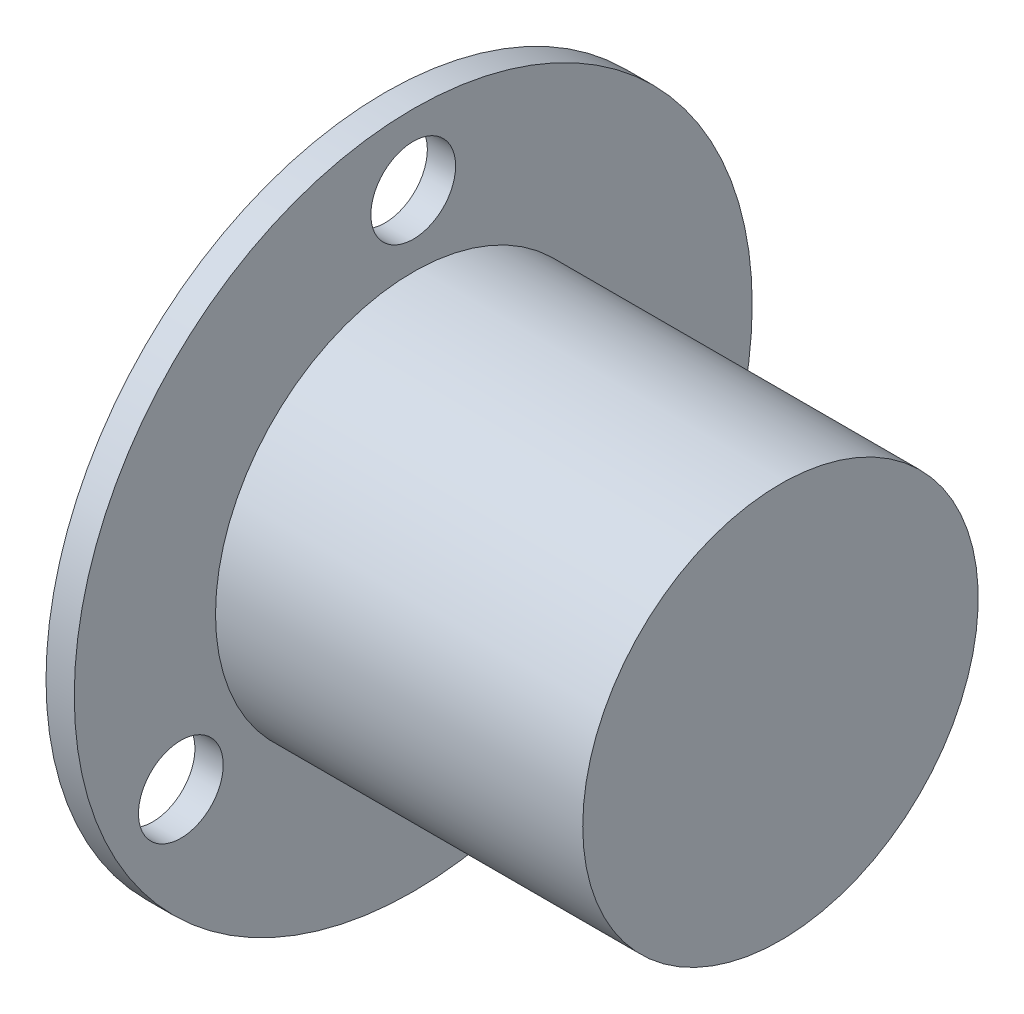
ISO-10303-21;
HEADER;
FILE_DESCRIPTION(('STEP AP214'),'2;1');
FILE_NAME('part.step','',(''),(''),'','','');
FILE_SCHEMA(('AUTOMOTIVE_DESIGN { 1 0 10303 214 1 1 1 1 }'));
ENDSEC;
DATA;
#1=APPLICATION_CONTEXT('core data for automotive mechanical design processes');
#2=APPLICATION_PROTOCOL_DEFINITION('international standard','automotive_design',2000,#1);
#3=PRODUCT_CONTEXT('',#1,'mechanical');
#4=PRODUCT('Part','Part','',(#3));
#5=PRODUCT_RELATED_PRODUCT_CATEGORY('part','',(#4));
#6=PRODUCT_DEFINITION_FORMATION('','',#4);
#7=PRODUCT_DEFINITION_CONTEXT('part definition',#1,'design');
#8=PRODUCT_DEFINITION('design','',#6,#7);
#9=PRODUCT_DEFINITION_SHAPE('','',#8);
#10=(LENGTH_UNIT() NAMED_UNIT(*) SI_UNIT(.MILLI.,.METRE.));
#11=(NAMED_UNIT(*) PLANE_ANGLE_UNIT() SI_UNIT($,.RADIAN.));
#12=(NAMED_UNIT(*) SI_UNIT($,.STERADIAN.) SOLID_ANGLE_UNIT());
#13=UNCERTAINTY_MEASURE_WITH_UNIT(LENGTH_MEASURE(1.E-05),#10,'distance_accuracy_value','');
#14=(GEOMETRIC_REPRESENTATION_CONTEXT(3) GLOBAL_UNCERTAINTY_ASSIGNED_CONTEXT((#13)) GLOBAL_UNIT_ASSIGNED_CONTEXT((#10,
#11,#12)) REPRESENTATION_CONTEXT('',''));
#15=CARTESIAN_POINT('',(0.,0.,0.));
#16=DIRECTION('',(0.,0.,1.));
#17=DIRECTION('',(1.,0.,0.));
#18=AXIS2_PLACEMENT_3D('',#15,#16,#17);
#19=CARTESIAN_POINT('',(0.,0.,0.));
#20=DIRECTION('',(1.,0.,0.));
#21=DIRECTION('',(0.,0.,-1.));
#22=AXIS2_PLACEMENT_3D('',#19,#20,#21);
#23=PLANE('',#22);
#24=CARTESIAN_POINT('',(0.,0.,0.));
#25=DIRECTION('',(1.,0.,0.));
#26=DIRECTION('',(0.,0.,-1.));
#27=AXIS2_PLACEMENT_3D('',#24,#25,#26);
#28=CIRCLE('',#27,12.);
#29=CARTESIAN_POINT('',(0.,0.,-12.));
#30=VERTEX_POINT('',#29);
#31=EDGE_CURVE('E42',#30,#30,#28,.T.);
#32=ORIENTED_EDGE('',*,*,#31,.F.);
#33=EDGE_LOOP('',(#32));
#34=FACE_BOUND('',#33,.T.);
#35=CARTESIAN_POINT('',(0.,9.5,0.));
#36=DIRECTION('',(1.,0.,0.));
#37=DIRECTION('',(0.,0.,-1.));
#38=AXIS2_PLACEMENT_3D('',#35,#36,#37);
#39=CIRCLE('',#38,1.5);
#40=CARTESIAN_POINT('',(0.,9.5,-1.5));
#41=VERTEX_POINT('',#40);
#42=EDGE_CURVE('E52',#41,#41,#39,.T.);
#43=ORIENTED_EDGE('',*,*,#42,.T.);
#44=EDGE_LOOP('',(#43));
#45=FACE_BOUND('',#44,.T.);
#46=CARTESIAN_POINT('',(0.,-4.74999999999965,-8.22724133595277));
#47=DIRECTION('',(1.,0.,0.));
#48=DIRECTION('',(0.,0.,-1.));
#49=AXIS2_PLACEMENT_3D('',#46,#47,#48);
#50=CIRCLE('',#49,1.50000000000052);
#51=CARTESIAN_POINT('',(0.,-4.74999999999965,-9.7272413359533));
#52=VERTEX_POINT('',#51);
#53=EDGE_CURVE('E58',#52,#52,#50,.T.);
#54=ORIENTED_EDGE('',*,*,#53,.T.);
#55=EDGE_LOOP('',(#54));
#56=FACE_BOUND('',#55,.T.);
#57=CARTESIAN_POINT('',(0.,-4.75000000000035,8.22724133595156));
#58=DIRECTION('',(1.,0.,0.));
#59=DIRECTION('',(0.,0.,-1.));
#60=AXIS2_PLACEMENT_3D('',#57,#58,#59);
#61=CIRCLE('',#60,1.50000000000077);
#62=CARTESIAN_POINT('',(0.,-4.75000000000035,6.72724133595079));
#63=VERTEX_POINT('',#62);
#64=EDGE_CURVE('E64',#63,#63,#61,.T.);
#65=ORIENTED_EDGE('',*,*,#64,.T.);
#66=EDGE_LOOP('',(#65));
#67=FACE_BOUND('',#66,.T.);
#68=CARTESIAN_POINT('',(0.,0.,0.));
#69=DIRECTION('',(1.,0.,0.));
#70=DIRECTION('',(0.,0.,-1.));
#71=AXIS2_PLACEMENT_3D('',#68,#69,#70);
#72=CIRCLE('',#71,2.5);
#73=CARTESIAN_POINT('',(0.,0.,-2.5));
#74=VERTEX_POINT('',#73);
#75=EDGE_CURVE('E10',#74,#74,#72,.F.);
#76=ORIENTED_EDGE('',*,*,#75,.F.);
#77=EDGE_LOOP('',(#76));
#78=FACE_BOUND('',#77,.T.);
#79=ADVANCED_FACE('F31',(#34,#45,#56,#67,#78),#23,.F.);
#80=CARTESIAN_POINT('',(1.,0.,0.));
#81=DIRECTION('',(1.,0.,0.));
#82=DIRECTION('',(0.,0.,-1.));
#83=AXIS2_PLACEMENT_3D('',#80,#81,#82);
#84=PLANE('',#83);
#85=CARTESIAN_POINT('',(1.,-4.75000000000035,8.22724133595156));
#86=DIRECTION('',(1.,0.,0.));
#87=DIRECTION('',(0.,0.,-1.));
#88=AXIS2_PLACEMENT_3D('',#85,#86,#87);
#89=CIRCLE('',#88,1.50000000000077);
#90=CARTESIAN_POINT('',(1.,-4.75000000000035,6.72724133595079));
#91=VERTEX_POINT('',#90);
#92=EDGE_CURVE('E67',#91,#91,#89,.T.);
#93=ORIENTED_EDGE('',*,*,#92,.F.);
#94=EDGE_LOOP('',(#93));
#95=FACE_BOUND('',#94,.T.);
#96=CARTESIAN_POINT('',(1.,-4.74999999999965,-8.22724133595277));
#97=DIRECTION('',(1.,0.,0.));
#98=DIRECTION('',(0.,0.,-1.));
#99=AXIS2_PLACEMENT_3D('',#96,#97,#98);
#100=CIRCLE('',#99,1.50000000000052);
#101=CARTESIAN_POINT('',(1.,-4.74999999999965,-9.7272413359533));
#102=VERTEX_POINT('',#101);
#103=EDGE_CURVE('E61',#102,#102,#100,.T.);
#104=ORIENTED_EDGE('',*,*,#103,.F.);
#105=EDGE_LOOP('',(#104));
#106=FACE_BOUND('',#105,.T.);
#107=CARTESIAN_POINT('',(1.,9.5,0.));
#108=DIRECTION('',(1.,0.,0.));
#109=DIRECTION('',(0.,0.,-1.));
#110=AXIS2_PLACEMENT_3D('',#107,#108,#109);
#111=CIRCLE('',#110,1.5);
#112=CARTESIAN_POINT('',(1.,9.5,-1.5));
#113=VERTEX_POINT('',#112);
#114=EDGE_CURVE('E55',#113,#113,#111,.T.);
#115=ORIENTED_EDGE('',*,*,#114,.F.);
#116=EDGE_LOOP('',(#115));
#117=FACE_BOUND('',#116,.T.);
#118=CARTESIAN_POINT('',(1.,0.,0.));
#119=DIRECTION('',(1.,0.,0.));
#120=DIRECTION('',(0.,0.,-1.));
#121=AXIS2_PLACEMENT_3D('',#118,#119,#120);
#122=CIRCLE('',#121,12.);
#123=CARTESIAN_POINT('',(1.,0.,-12.));
#124=VERTEX_POINT('',#123);
#125=EDGE_CURVE('E38',#124,#124,#122,.T.);
#126=ORIENTED_EDGE('',*,*,#125,.T.);
#127=EDGE_LOOP('',(#126));
#128=FACE_BOUND('',#127,.T.);
#129=CARTESIAN_POINT('',(1.,0.,0.));
#130=DIRECTION('',(1.,0.,0.));
#131=DIRECTION('',(0.,0.,-1.));
#132=AXIS2_PLACEMENT_3D('',#129,#130,#131);
#133=CIRCLE('',#132,7.);
#134=CARTESIAN_POINT('',(0.999999999999999,0.,7.));
#135=VERTEX_POINT('',#134);
#136=EDGE_CURVE('E49',#135,#135,#133,.T.);
#137=ORIENTED_EDGE('',*,*,#136,.F.);
#138=EDGE_LOOP('',(#137));
#139=FACE_BOUND('',#138,.T.);
#140=ADVANCED_FACE('F92',(#95,#106,#117,#128,#139),#84,.T.);
#141=CARTESIAN_POINT('',(1.,0.,0.));
#142=DIRECTION('',(-1.,0.,0.));
#143=DIRECTION('',(0.,0.,1.));
#144=AXIS2_PLACEMENT_3D('',#141,#142,#143);
#145=CYLINDRICAL_SURFACE('',#144,12.);
#146=ORIENTED_EDGE('',*,*,#125,.F.);
#147=EDGE_LOOP('',(#146));
#148=FACE_BOUND('',#147,.T.);
#149=ORIENTED_EDGE('',*,*,#31,.T.);
#150=EDGE_LOOP('',(#149));
#151=FACE_BOUND('',#150,.T.);
#152=ADVANCED_FACE('F33',(#148,#151),#145,.T.);
#153=CARTESIAN_POINT('',(14.,0.,0.));
#154=DIRECTION('',(-1.,0.,0.));
#155=DIRECTION('',(0.,0.,1.));
#156=AXIS2_PLACEMENT_3D('',#153,#154,#155);
#157=CYLINDRICAL_SURFACE('',#156,7.);
#158=CARTESIAN_POINT('',(14.,0.,0.));
#159=DIRECTION('',(1.,0.,0.));
#160=DIRECTION('',(0.,0.,-1.));
#161=AXIS2_PLACEMENT_3D('',#158,#159,#160);
#162=CIRCLE('',#161,7.);
#163=CARTESIAN_POINT('',(14.,0.,7.));
#164=VERTEX_POINT('',#163);
#165=EDGE_CURVE('E47',#164,#164,#162,.T.);
#166=CARTESIAN_POINT('',(14.,0.,7.));
#167=CARTESIAN_POINT('',(13.8645833333333,0.,7.));
#168=CARTESIAN_POINT('',(13.7291666666667,0.,7.));
#169=CARTESIAN_POINT('',(13.4583333333333,0.,7.));
#170=CARTESIAN_POINT('',(13.3229166666667,0.,7.));
#171=CARTESIAN_POINT('',(13.0520833333333,0.,7.));
#172=CARTESIAN_POINT('',(12.9166666666667,0.,7.));
#173=CARTESIAN_POINT('',(12.6458333333333,0.,7.));
#174=CARTESIAN_POINT('',(12.5104166666667,0.,7.));
#175=CARTESIAN_POINT('',(12.2395833333333,0.,7.));
#176=CARTESIAN_POINT('',(12.1041666666667,0.,7.));
#177=CARTESIAN_POINT('',(11.8333333333333,0.,7.));
#178=CARTESIAN_POINT('',(11.6979166666667,0.,7.));
#179=CARTESIAN_POINT('',(11.4270833333333,0.,7.));
#180=CARTESIAN_POINT('',(11.2916666666667,0.,7.));
#181=CARTESIAN_POINT('',(11.0208333333333,0.,7.));
#182=CARTESIAN_POINT('',(10.8854166666667,0.,7.));
#183=CARTESIAN_POINT('',(10.6145833333333,0.,7.));
#184=CARTESIAN_POINT('',(10.4791666666667,0.,7.));
#185=CARTESIAN_POINT('',(10.2083333333333,0.,7.));
#186=CARTESIAN_POINT('',(10.0729166666667,0.,7.));
#187=CARTESIAN_POINT('',(9.80208333333333,0.,7.));
#188=CARTESIAN_POINT('',(9.66666666666667,0.,7.));
#189=CARTESIAN_POINT('',(9.39583333333333,0.,7.));
#190=CARTESIAN_POINT('',(9.26041666666666,0.,7.));
#191=CARTESIAN_POINT('',(8.98958333333333,0.,7.));
#192=CARTESIAN_POINT('',(8.85416666666666,0.,7.));
#193=CARTESIAN_POINT('',(8.58333333333333,0.,7.));
#194=CARTESIAN_POINT('',(8.44791666666667,0.,7.));
#195=CARTESIAN_POINT('',(8.17708333333333,0.,7.));
#196=CARTESIAN_POINT('',(8.04166666666667,0.,7.));
#197=CARTESIAN_POINT('',(7.77083333333333,0.,7.));
#198=CARTESIAN_POINT('',(7.63541666666667,0.,7.));
#199=CARTESIAN_POINT('',(7.36458333333333,0.,7.));
#200=CARTESIAN_POINT('',(7.22916666666667,0.,7.));
#201=CARTESIAN_POINT('',(6.95833333333333,0.,7.));
#202=CARTESIAN_POINT('',(6.82291666666667,0.,7.));
#203=CARTESIAN_POINT('',(6.55208333333333,0.,7.));
#204=CARTESIAN_POINT('',(6.41666666666667,0.,7.));
#205=CARTESIAN_POINT('',(6.14583333333333,0.,7.));
#206=CARTESIAN_POINT('',(6.01041666666667,0.,7.));
#207=CARTESIAN_POINT('',(5.73958333333333,0.,7.));
#208=CARTESIAN_POINT('',(5.60416666666667,0.,7.));
#209=CARTESIAN_POINT('',(5.33333333333333,0.,7.));
#210=CARTESIAN_POINT('',(5.19791666666667,0.,7.));
#211=CARTESIAN_POINT('',(4.92708333333333,0.,7.));
#212=CARTESIAN_POINT('',(4.79166666666667,0.,7.));
#213=CARTESIAN_POINT('',(4.52083333333333,0.,7.));
#214=CARTESIAN_POINT('',(4.38541666666667,0.,7.));
#215=CARTESIAN_POINT('',(4.11458333333333,0.,7.));
#216=CARTESIAN_POINT('',(3.97916666666666,0.,7.));
#217=CARTESIAN_POINT('',(3.70833333333333,0.,7.));
#218=CARTESIAN_POINT('',(3.57291666666667,0.,7.));
#219=CARTESIAN_POINT('',(3.30208333333333,0.,7.));
#220=CARTESIAN_POINT('',(3.16666666666667,0.,7.));
#221=CARTESIAN_POINT('',(2.89583333333333,0.,7.));
#222=CARTESIAN_POINT('',(2.76041666666667,0.,7.));
#223=CARTESIAN_POINT('',(2.48958333333333,0.,7.));
#224=CARTESIAN_POINT('',(2.35416666666667,0.,7.));
#225=CARTESIAN_POINT('',(2.08333333333333,0.,7.));
#226=CARTESIAN_POINT('',(1.94791666666667,0.,7.));
#227=CARTESIAN_POINT('',(1.67708333333333,0.,7.));
#228=CARTESIAN_POINT('',(1.54166666666667,0.,7.));
#229=CARTESIAN_POINT('',(1.27083333333333,0.,7.));
#230=CARTESIAN_POINT('',(1.13541666666667,0.,7.));
#231=CARTESIAN_POINT('',(0.999999999999999,0.,7.));
#232=B_SPLINE_CURVE_WITH_KNOTS('',3,(#166,#167,#168,#169,#170,#171,#172,#173,#174,#175,#176,
#177,#178,#179,#180,#181,#182,#183,#184,#185,#186,#187,#188,#189,#190,#191,#192,#193,#194,#195,
#196,#197,#198,#199,#200,#201,#202,#203,#204,#205,#206,#207,#208,#209,#210,#211,#212,#213,#214,
#215,#216,#217,#218,#219,#220,#221,#222,#223,#224,#225,#226,#227,#228,#229,#230,#231),
.UNSPECIFIED.,.F.,.F.,(4,2,2,2,2,2,2,2,2,2,2,2,2,2,2,2,2,2,2,2,2,2,2,2,2,2,2,2,2,2,2,2,4),(0.,
0.406249999999999,0.812499999999999,1.21875,1.625,2.03125,2.4375,2.84375,3.25,3.65625,4.0625,
4.46875,4.875,5.28125,5.6875,6.09375,6.5,6.90625,7.3125,7.71875,8.125,8.53125,8.9375,9.34375,
9.75,10.15625,10.5625,10.96875,11.375,11.78125,12.1875,12.59375,13.),.UNSPECIFIED.);
#233=EDGE_CURVE('BSEAM103',#164,#135,#232,.T.);
#234=ORIENTED_EDGE('',*,*,#165,.F.);
#235=ORIENTED_EDGE('',*,*,#136,.T.);
#236=ORIENTED_EDGE('',*,*,#233,.T.);
#237=ORIENTED_EDGE('',*,*,#233,.F.);
#238=EDGE_LOOP('',(#234,#236,#235,#237));
#239=FACE_BOUND('',#238,.T.);
#240=ADVANCED_FACE('F103',(#239),#157,.T.);
#241=CARTESIAN_POINT('',(14.,0.,0.));
#242=DIRECTION('',(1.,0.,0.));
#243=DIRECTION('',(0.,0.,-1.));
#244=AXIS2_PLACEMENT_3D('',#241,#242,#243);
#245=PLANE('',#244);
#246=ORIENTED_EDGE('',*,*,#165,.T.);
#247=EDGE_LOOP('',(#246));
#248=FACE_BOUND('',#247,.T.);
#249=ADVANCED_FACE('F106',(#248),#245,.T.);
#250=CARTESIAN_POINT('',(0.,9.5,0.));
#251=DIRECTION('',(1.,0.,0.));
#252=DIRECTION('',(0.,0.,-1.));
#253=AXIS2_PLACEMENT_3D('',#250,#251,#252);
#254=CYLINDRICAL_SURFACE('',#253,1.5);
#255=ORIENTED_EDGE('',*,*,#42,.F.);
#256=EDGE_LOOP('',(#255));
#257=FACE_BOUND('',#256,.T.);
#258=ORIENTED_EDGE('',*,*,#114,.T.);
#259=EDGE_LOOP('',(#258));
#260=FACE_BOUND('',#259,.T.);
#261=ADVANCED_FACE('F110',(#257,#260),#254,.F.);
#262=CARTESIAN_POINT('',(0.,-4.74999999999965,-8.22724133595277));
#263=DIRECTION('',(1.,0.,0.));
#264=DIRECTION('',(0.,0.,-1.));
#265=AXIS2_PLACEMENT_3D('',#262,#263,#264);
#266=CYLINDRICAL_SURFACE('',#265,1.50000000000052);
#267=ORIENTED_EDGE('',*,*,#53,.F.);
#268=EDGE_LOOP('',(#267));
#269=FACE_BOUND('',#268,.T.);
#270=ORIENTED_EDGE('',*,*,#103,.T.);
#271=EDGE_LOOP('',(#270));
#272=FACE_BOUND('',#271,.T.);
#273=ADVANCED_FACE('F88',(#269,#272),#266,.F.);
#274=CARTESIAN_POINT('',(0.,-4.75000000000035,8.22724133595156));
#275=DIRECTION('',(1.,0.,0.));
#276=DIRECTION('',(0.,0.,-1.));
#277=AXIS2_PLACEMENT_3D('',#274,#275,#276);
#278=CYLINDRICAL_SURFACE('',#277,1.50000000000077);
#279=ORIENTED_EDGE('',*,*,#64,.F.);
#280=EDGE_LOOP('',(#279));
#281=FACE_BOUND('',#280,.T.);
#282=ORIENTED_EDGE('',*,*,#92,.T.);
#283=EDGE_LOOP('',(#282));
#284=FACE_BOUND('',#283,.T.);
#285=ADVANCED_FACE('F80',(#281,#284),#278,.F.);
#286=CARTESIAN_POINT('',(-5.,0.,0.));
#287=DIRECTION('',(1.,0.,0.));
#288=DIRECTION('',(0.,0.,-1.));
#289=AXIS2_PLACEMENT_3D('',#286,#287,#288);
#290=CYLINDRICAL_SURFACE('',#289,2.5);
#291=CARTESIAN_POINT('',(-5.,0.,0.));
#292=DIRECTION('',(-1.,0.,0.));
#293=DIRECTION('',(0.,0.,1.));
#294=AXIS2_PLACEMENT_3D('',#291,#292,#293);
#295=CIRCLE('',#294,2.5);
#296=CARTESIAN_POINT('',(-5.,0.,2.5));
#297=VERTEX_POINT('',#296);
#298=EDGE_CURVE('E70',#297,#297,#295,.T.);
#299=ORIENTED_EDGE('',*,*,#298,.F.);
#300=EDGE_LOOP('',(#299));
#301=FACE_BOUND('',#300,.T.);
#302=ORIENTED_EDGE('',*,*,#75,.T.);
#303=EDGE_LOOP('',(#302));
#304=FACE_BOUND('',#303,.T.);
#305=ADVANCED_FACE('F78',(#301,#304),#290,.T.);
#306=CARTESIAN_POINT('',(-5.,0.,0.));
#307=DIRECTION('',(-1.,0.,0.));
#308=DIRECTION('',(0.,0.,1.));
#309=AXIS2_PLACEMENT_3D('',#306,#307,#308);
#310=PLANE('',#309);
#311=ORIENTED_EDGE('',*,*,#298,.T.);
#312=EDGE_LOOP('',(#311));
#313=FACE_BOUND('',#312,.T.);
#314=ADVANCED_FACE('F76',(#313),#310,.T.);
#315=CLOSED_SHELL('',(#79,#140,#152,#240,#249,#261,#273,#285,#305,#314));
#316=MANIFOLD_SOLID_BREP('B2',#315);
#317=ADVANCED_BREP_SHAPE_REPRESENTATION('',(#18,#316),#14);
#318=SHAPE_DEFINITION_REPRESENTATION(#9,#317);
ENDSEC;
END-ISO-10303-21;
